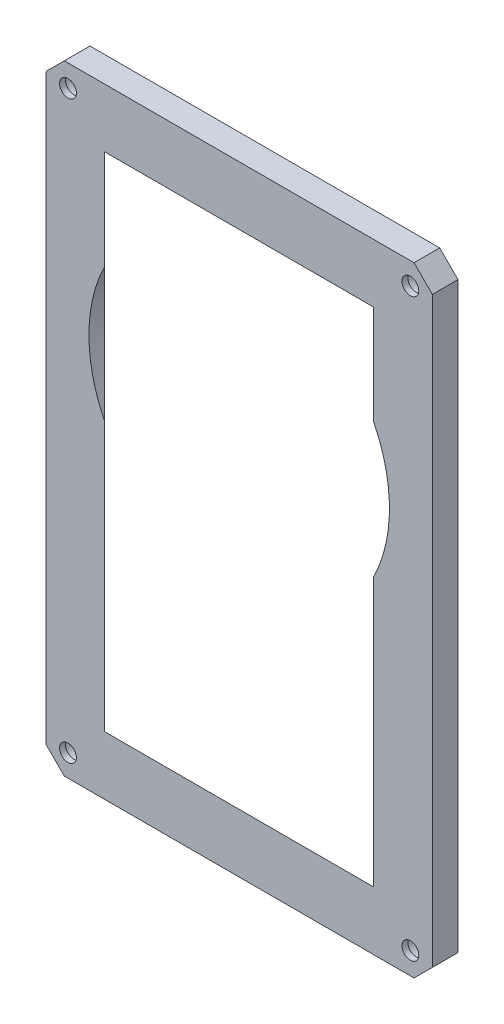
ISO-10303-21;
HEADER;
FILE_DESCRIPTION(('STEP AP214'),'2;1');
FILE_NAME('part.step','',(''),(''),'','','');
FILE_SCHEMA(('AUTOMOTIVE_DESIGN { 1 0 10303 214 1 1 1 1 }'));
ENDSEC;
DATA;
#1=APPLICATION_CONTEXT('core data for automotive mechanical design processes');
#2=APPLICATION_PROTOCOL_DEFINITION('international standard','automotive_design',2000,#1);
#3=PRODUCT_CONTEXT('',#1,'mechanical');
#4=PRODUCT('Part','Part','',(#3));
#5=PRODUCT_RELATED_PRODUCT_CATEGORY('part','',(#4));
#6=PRODUCT_DEFINITION_FORMATION('','',#4);
#7=PRODUCT_DEFINITION_CONTEXT('part definition',#1,'design');
#8=PRODUCT_DEFINITION('design','',#6,#7);
#9=PRODUCT_DEFINITION_SHAPE('','',#8);
#10=(LENGTH_UNIT() NAMED_UNIT(*) SI_UNIT(.MILLI.,.METRE.));
#11=(NAMED_UNIT(*) PLANE_ANGLE_UNIT() SI_UNIT($,.RADIAN.));
#12=(NAMED_UNIT(*) SI_UNIT($,.STERADIAN.) SOLID_ANGLE_UNIT());
#13=UNCERTAINTY_MEASURE_WITH_UNIT(LENGTH_MEASURE(1.E-05),#10,'distance_accuracy_value','');
#14=(GEOMETRIC_REPRESENTATION_CONTEXT(3) GLOBAL_UNCERTAINTY_ASSIGNED_CONTEXT((#13)) GLOBAL_UNIT_ASSIGNED_CONTEXT((#10,
#11,#12)) REPRESENTATION_CONTEXT('',''));
#15=CARTESIAN_POINT('',(0.,0.,0.));
#16=DIRECTION('',(0.,0.,1.));
#17=DIRECTION('',(1.,0.,0.));
#18=AXIS2_PLACEMENT_3D('',#15,#16,#17);
#19=CARTESIAN_POINT('',(-46.7,-78.5,-7.001));
#20=DIRECTION('',(0.,0.,1.));
#21=DIRECTION('',(1.,0.,0.));
#22=AXIS2_PLACEMENT_3D('',#19,#20,#21);
#23=CYLINDRICAL_SURFACE('',#22,2.3);
#24=CARTESIAN_POINT('',(-46.7,-78.5,0.));
#25=DIRECTION('',(0.,0.,1.));
#26=DIRECTION('',(1.,0.,0.));
#27=AXIS2_PLACEMENT_3D('',#24,#25,#26);
#28=CIRCLE('',#27,2.3);
#29=CARTESIAN_POINT('',(-44.4,-78.5,0.));
#30=VERTEX_POINT('',#29);
#31=EDGE_CURVE('E299',#30,#30,#28,.F.);
#32=ORIENTED_EDGE('',*,*,#31,.F.);
#33=EDGE_LOOP('',(#32));
#34=FACE_BOUND('',#33,.T.);
#35=CARTESIAN_POINT('',(-46.7,-78.5,-1.6));
#36=DIRECTION('',(0.,0.,-1.));
#37=DIRECTION('',(-1.,0.,0.));
#38=AXIS2_PLACEMENT_3D('',#35,#36,#37);
#39=CIRCLE('',#38,2.3);
#40=CARTESIAN_POINT('',(-49.,-78.5,-1.6));
#41=VERTEX_POINT('',#40);
#42=EDGE_CURVE('E268',#41,#41,#39,.T.);
#43=ORIENTED_EDGE('',*,*,#42,.T.);
#44=EDGE_LOOP('',(#43));
#45=FACE_BOUND('',#44,.T.);
#46=ADVANCED_FACE('F44',(#34,#45),#23,.F.);
#47=CARTESIAN_POINT('',(46.7,78.5,-7.001));
#48=DIRECTION('',(0.,0.,1.));
#49=DIRECTION('',(1.,0.,0.));
#50=AXIS2_PLACEMENT_3D('',#47,#48,#49);
#51=CYLINDRICAL_SURFACE('',#50,2.3);
#52=CARTESIAN_POINT('',(46.7,78.5,0.));
#53=DIRECTION('',(0.,0.,1.));
#54=DIRECTION('',(1.,0.,0.));
#55=AXIS2_PLACEMENT_3D('',#52,#53,#54);
#56=CIRCLE('',#55,2.3);
#57=CARTESIAN_POINT('',(49.,78.5,0.));
#58=VERTEX_POINT('',#57);
#59=EDGE_CURVE('E300',#58,#58,#56,.F.);
#60=ORIENTED_EDGE('',*,*,#59,.F.);
#61=EDGE_LOOP('',(#60));
#62=FACE_BOUND('',#61,.T.);
#63=CARTESIAN_POINT('',(46.7,78.5,-1.6));
#64=DIRECTION('',(0.,0.,-1.));
#65=DIRECTION('',(-1.,0.,0.));
#66=AXIS2_PLACEMENT_3D('',#63,#64,#65);
#67=CIRCLE('',#66,2.3);
#68=CARTESIAN_POINT('',(44.4,78.5,-1.6));
#69=VERTEX_POINT('',#68);
#70=EDGE_CURVE('E271',#69,#69,#67,.T.);
#71=ORIENTED_EDGE('',*,*,#70,.T.);
#72=EDGE_LOOP('',(#71));
#73=FACE_BOUND('',#72,.T.);
#74=ADVANCED_FACE('F351',(#62,#73),#51,.F.);
#75=CARTESIAN_POINT('',(0.,0.,-7.));
#76=DIRECTION('',(0.,0.,1.));
#77=DIRECTION('',(1.,0.,0.));
#78=AXIS2_PLACEMENT_3D('',#75,#76,#77);
#79=PLANE('',#78);
#80=CARTESIAN_POINT('',(46.7000000000001,-78.5,-7.));
#81=DIRECTION('',(0.,0.,-1.));
#82=DIRECTION('',(1.,0.,0.));
#83=AXIS2_PLACEMENT_3D('',#80,#81,#82);
#84=CIRCLE('',#83,3.7);
#85=CARTESIAN_POINT('',(43.0000000000001,-78.5,-7.));
#86=VERTEX_POINT('',#85);
#87=EDGE_CURVE('E281',#86,#86,#84,.T.);
#88=ORIENTED_EDGE('',*,*,#87,.F.);
#89=EDGE_LOOP('',(#88));
#90=FACE_BOUND('',#89,.T.);
#91=CARTESIAN_POINT('',(-46.7,-78.5,-7.));
#92=DIRECTION('',(0.,0.,-1.));
#93=DIRECTION('',(-1.,0.,0.));
#94=AXIS2_PLACEMENT_3D('',#91,#92,#93);
#95=CIRCLE('',#94,3.7);
#96=CARTESIAN_POINT('',(-50.4,-78.5,-7.));
#97=VERTEX_POINT('',#96);
#98=EDGE_CURVE('E272',#97,#97,#95,.T.);
#99=ORIENTED_EDGE('',*,*,#98,.F.);
#100=EDGE_LOOP('',(#99));
#101=FACE_BOUND('',#100,.T.);
#102=CARTESIAN_POINT('',(-46.7,78.5,-7.));
#103=DIRECTION('',(0.,0.,-1.));
#104=DIRECTION('',(1.,0.,0.));
#105=AXIS2_PLACEMENT_3D('',#102,#103,#104);
#106=CIRCLE('',#105,3.7);
#107=CARTESIAN_POINT('',(-50.4,78.5,-7.));
#108=VERTEX_POINT('',#107);
#109=EDGE_CURVE('E261',#108,#108,#106,.T.);
#110=ORIENTED_EDGE('',*,*,#109,.F.);
#111=EDGE_LOOP('',(#110));
#112=FACE_BOUND('',#111,.T.);
#113=CARTESIAN_POINT('',(46.7,78.5,-7.));
#114=DIRECTION('',(0.,0.,-1.));
#115=DIRECTION('',(-1.,0.,0.));
#116=AXIS2_PLACEMENT_3D('',#113,#114,#115);
#117=CIRCLE('',#116,3.7);
#118=CARTESIAN_POINT('',(43.,78.5,-7.));
#119=VERTEX_POINT('',#118);
#120=EDGE_CURVE('E290',#119,#119,#117,.T.);
#121=ORIENTED_EDGE('',*,*,#120,.F.);
#122=EDGE_LOOP('',(#121));
#123=FACE_BOUND('',#122,.T.);
#124=DIRECTION('',(0.,-1.,0.));
#125=VECTOR('',#124,1.);
#126=CARTESIAN_POINT('',(-43.7000000000002,0.,-7.));
#127=LINE('',#126,#125);
#128=CARTESIAN_POINT('',(-43.7000000000002,75.5000000000002,-7.));
#129=VERTEX_POINT('',#128);
#130=CARTESIAN_POINT('',(-43.7000000000002,-75.5000000000002,-7.));
#131=VERTEX_POINT('',#130);
#132=EDGE_CURVE('E169',#129,#131,#127,.T.);
#133=ORIENTED_EDGE('',*,*,#132,.T.);
#134=DIRECTION('',(1.,0.,0.));
#135=VECTOR('',#134,1.);
#136=CARTESIAN_POINT('',(0.,-75.5000000000002,-7.));
#137=LINE('',#136,#135);
#138=CARTESIAN_POINT('',(43.7000000000002,-75.5000000000002,-7.));
#139=VERTEX_POINT('',#138);
#140=EDGE_CURVE('E165',#131,#139,#137,.T.);
#141=ORIENTED_EDGE('',*,*,#140,.T.);
#142=DIRECTION('',(0.,1.,0.));
#143=VECTOR('',#142,1.);
#144=CARTESIAN_POINT('',(43.7000000000001,0.,-7.));
#145=LINE('',#144,#143);
#146=CARTESIAN_POINT('',(43.7000000000001,75.5000000000002,-7.));
#147=VERTEX_POINT('',#146);
#148=EDGE_CURVE('E243',#139,#147,#145,.T.);
#149=ORIENTED_EDGE('',*,*,#148,.T.);
#150=DIRECTION('',(-1.,0.,0.));
#151=VECTOR('',#150,1.);
#152=CARTESIAN_POINT('',(0.,75.5000000000002,-7.));
#153=LINE('',#152,#151);
#154=EDGE_CURVE('E245',#147,#129,#153,.T.);
#155=ORIENTED_EDGE('',*,*,#154,.T.);
#156=EDGE_LOOP('',(#133,#141,#149,#155));
#157=FACE_BOUND('',#156,.T.);
#158=DIRECTION('',(1.,0.,0.));
#159=VECTOR('',#158,1.);
#160=CARTESIAN_POINT('',(-52.7,-84.5,-7.));
#161=LINE('',#160,#159);
#162=CARTESIAN_POINT('',(-47.7,-84.5,-7.));
#163=VERTEX_POINT('',#162);
#164=CARTESIAN_POINT('',(47.7,-84.5,-7.));
#165=VERTEX_POINT('',#164);
#166=EDGE_CURVE('E309',#163,#165,#161,.T.);
#167=ORIENTED_EDGE('',*,*,#166,.F.);
#168=DIRECTION('',(0.707106781186549,-0.707106781186546,0.));
#169=VECTOR('',#168,1.);
#170=CARTESIAN_POINT('',(-52.7,-79.5,-7.));
#171=LINE('',#170,#169);
#172=CARTESIAN_POINT('',(-52.7,-79.5,-7.));
#173=VERTEX_POINT('',#172);
#174=EDGE_CURVE('E231',#163,#173,#171,.F.);
#175=ORIENTED_EDGE('',*,*,#174,.T.);
#176=DIRECTION('',(0.,-1.,0.));
#177=VECTOR('',#176,1.);
#178=CARTESIAN_POINT('',(-52.7,84.5,-7.));
#179=LINE('',#178,#177);
#180=CARTESIAN_POINT('',(-52.7,79.5,-7.));
#181=VERTEX_POINT('',#180);
#182=EDGE_CURVE('E206',#181,#173,#179,.T.);
#183=ORIENTED_EDGE('',*,*,#182,.F.);
#184=DIRECTION('',(-0.707106781186548,-0.707106781186548,0.));
#185=VECTOR('',#184,1.);
#186=CARTESIAN_POINT('',(-47.7,84.5,-7.));
#187=LINE('',#186,#185);
#188=CARTESIAN_POINT('',(-47.7,84.5,-7.));
#189=VERTEX_POINT('',#188);
#190=EDGE_CURVE('E225',#181,#189,#187,.F.);
#191=ORIENTED_EDGE('',*,*,#190,.T.);
#192=DIRECTION('',(-1.,0.,0.));
#193=VECTOR('',#192,1.);
#194=CARTESIAN_POINT('',(-52.7,84.5,-7.));
#195=LINE('',#194,#193);
#196=CARTESIAN_POINT('',(47.6999999999999,84.5,-7.));
#197=VERTEX_POINT('',#196);
#198=EDGE_CURVE('E198',#197,#189,#195,.T.);
#199=ORIENTED_EDGE('',*,*,#198,.F.);
#200=DIRECTION('',(-0.707106781186548,0.707106781186548,0.));
#201=VECTOR('',#200,1.);
#202=CARTESIAN_POINT('',(52.7,79.4999999999999,-7.));
#203=LINE('',#202,#201);
#204=CARTESIAN_POINT('',(52.7,79.4999999999999,-7.));
#205=VERTEX_POINT('',#204);
#206=EDGE_CURVE('E227',#197,#205,#203,.F.);
#207=ORIENTED_EDGE('',*,*,#206,.T.);
#208=DIRECTION('',(0.,1.,0.));
#209=VECTOR('',#208,1.);
#210=CARTESIAN_POINT('',(52.7,84.5,-7.));
#211=LINE('',#210,#209);
#212=CARTESIAN_POINT('',(52.7,-79.5,-7.));
#213=VERTEX_POINT('',#212);
#214=EDGE_CURVE('E311',#213,#205,#211,.T.);
#215=ORIENTED_EDGE('',*,*,#214,.F.);
#216=DIRECTION('',(0.707106781186547,0.707106781186548,0.));
#217=VECTOR('',#216,1.);
#218=CARTESIAN_POINT('',(47.7,-84.5,-7.));
#219=LINE('',#218,#217);
#220=EDGE_CURVE('E229',#213,#165,#219,.F.);
#221=ORIENTED_EDGE('',*,*,#220,.T.);
#222=EDGE_LOOP('',(#167,#175,#183,#191,#199,#207,#215,#221));
#223=FACE_BOUND('',#222,.T.);
#224=ADVANCED_FACE('F248',(#90,#101,#112,#123,#157,#223),#79,.F.);
#225=CARTESIAN_POINT('',(0.,0.,0.));
#226=DIRECTION('',(0.,0.,1.));
#227=DIRECTION('',(1.,0.,0.));
#228=AXIS2_PLACEMENT_3D('',#225,#226,#227);
#229=PLANE('',#228);
#230=CARTESIAN_POINT('',(0.,23.1,0.));
#231=DIRECTION('',(0.,0.,1.));
#232=DIRECTION('',(1.,0.,0.));
#233=AXIS2_PLACEMENT_3D('',#230,#231,#232);
#234=CIRCLE('',#233,41.);
#235=CARTESIAN_POINT('',(36.7000000000001,4.82132389914427,0.));
#236=VERTEX_POINT('',#235);
#237=CARTESIAN_POINT('',(36.7000000000001,41.3786761008558,0.));
#238=VERTEX_POINT('',#237);
#239=EDGE_CURVE('E68',#236,#238,#234,.T.);
#240=ORIENTED_EDGE('',*,*,#239,.F.);
#241=DIRECTION('',(0.,1.,0.));
#242=VECTOR('',#241,1.);
#243=CARTESIAN_POINT('',(36.7000000000001,0.,0.));
#244=LINE('',#243,#242);
#245=CARTESIAN_POINT('',(36.7000000000001,-68.5000000000001,0.));
#246=VERTEX_POINT('',#245);
#247=EDGE_CURVE('E156',#236,#246,#244,.F.);
#248=ORIENTED_EDGE('',*,*,#247,.T.);
#249=DIRECTION('',(1.,0.,0.));
#250=VECTOR('',#249,1.);
#251=CARTESIAN_POINT('',(0.,-68.5000000000001,0.));
#252=LINE('',#251,#250);
#253=CARTESIAN_POINT('',(-36.7000000000001,-68.5000000000001,0.));
#254=VERTEX_POINT('',#253);
#255=EDGE_CURVE('E11',#246,#254,#252,.F.);
#256=ORIENTED_EDGE('',*,*,#255,.T.);
#257=DIRECTION('',(0.,-1.,0.));
#258=VECTOR('',#257,1.);
#259=CARTESIAN_POINT('',(-36.7000000000001,0.,0.));
#260=LINE('',#259,#258);
#261=CARTESIAN_POINT('',(-36.7000000000001,4.82132389914433,0.));
#262=VERTEX_POINT('',#261);
#263=EDGE_CURVE('E54',#254,#262,#260,.F.);
#264=ORIENTED_EDGE('',*,*,#263,.T.);
#265=CARTESIAN_POINT('',(0.,23.1,0.));
#266=DIRECTION('',(0.,0.,1.));
#267=DIRECTION('',(1.,0.,0.));
#268=AXIS2_PLACEMENT_3D('',#265,#266,#267);
#269=CIRCLE('',#268,41.);
#270=CARTESIAN_POINT('',(-36.7000000000001,41.3786761008557,0.));
#271=VERTEX_POINT('',#270);
#272=EDGE_CURVE('E61',#271,#262,#269,.T.);
#273=ORIENTED_EDGE('',*,*,#272,.F.);
#274=CARTESIAN_POINT('',(-36.7000000000001,68.5000000000001,0.));
#275=VERTEX_POINT('',#274);
#276=EDGE_CURVE('E174',#271,#275,#260,.F.);
#277=ORIENTED_EDGE('',*,*,#276,.T.);
#278=DIRECTION('',(-1.,0.,0.));
#279=VECTOR('',#278,1.);
#280=CARTESIAN_POINT('',(0.,68.5000000000001,0.));
#281=LINE('',#280,#279);
#282=CARTESIAN_POINT('',(36.7000000000001,68.5000000000001,0.));
#283=VERTEX_POINT('',#282);
#284=EDGE_CURVE('E167',#275,#283,#281,.F.);
#285=ORIENTED_EDGE('',*,*,#284,.T.);
#286=EDGE_CURVE('E158',#283,#238,#244,.F.);
#287=ORIENTED_EDGE('',*,*,#286,.T.);
#288=EDGE_LOOP('',(#240,#248,#256,#264,#273,#277,#285,#287));
#289=FACE_BOUND('',#288,.T.);
#290=ORIENTED_EDGE('',*,*,#31,.T.);
#291=EDGE_LOOP('',(#290));
#292=FACE_BOUND('',#291,.T.);
#293=CARTESIAN_POINT('',(46.7000000000001,-78.5,0.));
#294=DIRECTION('',(0.,0.,1.));
#295=DIRECTION('',(1.,0.,0.));
#296=AXIS2_PLACEMENT_3D('',#293,#294,#295);
#297=CIRCLE('',#296,2.3);
#298=CARTESIAN_POINT('',(49.0000000000001,-78.5,0.));
#299=VERTEX_POINT('',#298);
#300=EDGE_CURVE('E294',#299,#299,#297,.T.);
#301=ORIENTED_EDGE('',*,*,#300,.F.);
#302=EDGE_LOOP('',(#301));
#303=FACE_BOUND('',#302,.T.);
#304=CARTESIAN_POINT('',(-46.7,78.5,0.));
#305=DIRECTION('',(0.,0.,1.));
#306=DIRECTION('',(1.,0.,0.));
#307=AXIS2_PLACEMENT_3D('',#304,#305,#306);
#308=CIRCLE('',#307,2.3);
#309=CARTESIAN_POINT('',(-44.4,78.5,0.));
#310=VERTEX_POINT('',#309);
#311=EDGE_CURVE('E179',#310,#310,#308,.T.);
#312=ORIENTED_EDGE('',*,*,#311,.F.);
#313=EDGE_LOOP('',(#312));
#314=FACE_BOUND('',#313,.T.);
#315=DIRECTION('',(0.,-1.,0.));
#316=VECTOR('',#315,1.);
#317=CARTESIAN_POINT('',(-52.7,84.5,0.));
#318=LINE('',#317,#316);
#319=CARTESIAN_POINT('',(-52.7,79.5,0.));
#320=VERTEX_POINT('',#319);
#321=CARTESIAN_POINT('',(-52.7,-79.5,0.));
#322=VERTEX_POINT('',#321);
#323=EDGE_CURVE('E184',#320,#322,#318,.T.);
#324=ORIENTED_EDGE('',*,*,#323,.T.);
#325=DIRECTION('',(-0.707106781186549,0.707106781186546,0.));
#326=VECTOR('',#325,1.);
#327=CARTESIAN_POINT('',(-66.0999999999999,-66.1000000000002,0.));
#328=LINE('',#327,#326);
#329=CARTESIAN_POINT('',(-47.7,-84.5,0.));
#330=VERTEX_POINT('',#329);
#331=EDGE_CURVE('E218',#322,#330,#328,.F.);
#332=ORIENTED_EDGE('',*,*,#331,.T.);
#333=DIRECTION('',(1.,0.,0.));
#334=VECTOR('',#333,1.);
#335=CARTESIAN_POINT('',(-52.7,-84.5,0.));
#336=LINE('',#335,#334);
#337=CARTESIAN_POINT('',(47.7,-84.5,0.));
#338=VERTEX_POINT('',#337);
#339=EDGE_CURVE('E190',#330,#338,#336,.T.);
#340=ORIENTED_EDGE('',*,*,#339,.T.);
#341=DIRECTION('',(-0.707106781186547,-0.707106781186548,0.));
#342=VECTOR('',#341,1.);
#343=CARTESIAN_POINT('',(66.1,-66.0999999999999,0.));
#344=LINE('',#343,#342);
#345=CARTESIAN_POINT('',(52.7,-79.5,0.));
#346=VERTEX_POINT('',#345);
#347=EDGE_CURVE('E216',#338,#346,#344,.F.);
#348=ORIENTED_EDGE('',*,*,#347,.T.);
#349=DIRECTION('',(0.,1.,0.));
#350=VECTOR('',#349,1.);
#351=CARTESIAN_POINT('',(52.7,84.5,0.));
#352=LINE('',#351,#350);
#353=CARTESIAN_POINT('',(52.7,79.4999999999999,0.));
#354=VERTEX_POINT('',#353);
#355=EDGE_CURVE('E195',#346,#354,#352,.T.);
#356=ORIENTED_EDGE('',*,*,#355,.T.);
#357=DIRECTION('',(0.707106781186548,-0.707106781186548,0.));
#358=VECTOR('',#357,1.);
#359=CARTESIAN_POINT('',(66.1,66.1,0.));
#360=LINE('',#359,#358);
#361=CARTESIAN_POINT('',(47.6999999999999,84.5,0.));
#362=VERTEX_POINT('',#361);
#363=EDGE_CURVE('E214',#354,#362,#360,.F.);
#364=ORIENTED_EDGE('',*,*,#363,.T.);
#365=DIRECTION('',(-1.,0.,0.));
#366=VECTOR('',#365,1.);
#367=CARTESIAN_POINT('',(-52.7,84.5,0.));
#368=LINE('',#367,#366);
#369=CARTESIAN_POINT('',(-47.7,84.5,0.));
#370=VERTEX_POINT('',#369);
#371=EDGE_CURVE('E203',#362,#370,#368,.T.);
#372=ORIENTED_EDGE('',*,*,#371,.T.);
#373=DIRECTION('',(0.707106781186548,0.707106781186548,0.));
#374=VECTOR('',#373,1.);
#375=CARTESIAN_POINT('',(-66.1,66.1,0.));
#376=LINE('',#375,#374);
#377=EDGE_CURVE('E212',#370,#320,#376,.F.);
#378=ORIENTED_EDGE('',*,*,#377,.T.);
#379=EDGE_LOOP('',(#324,#332,#340,#348,#356,#364,#372,#378));
#380=FACE_BOUND('',#379,.T.);
#381=ORIENTED_EDGE('',*,*,#59,.T.);
#382=EDGE_LOOP('',(#381));
#383=FACE_BOUND('',#382,.T.);
#384=ADVANCED_FACE('F154',(#289,#292,#303,#314,#380,#383),#229,.T.);
#385=CARTESIAN_POINT('',(-52.7,84.5,-7.));
#386=DIRECTION('',(-1.,0.,0.));
#387=DIRECTION('',(0.,-1.,0.));
#388=AXIS2_PLACEMENT_3D('',#385,#386,#387);
#389=PLANE('',#388);
#390=ORIENTED_EDGE('',*,*,#182,.T.);
#391=DIRECTION('',(0.,0.,1.));
#392=VECTOR('',#391,1.);
#393=CARTESIAN_POINT('',(-52.7,-79.5,-7.));
#394=LINE('',#393,#392);
#395=EDGE_CURVE('E209',#173,#322,#394,.T.);
#396=ORIENTED_EDGE('',*,*,#395,.T.);
#397=ORIENTED_EDGE('',*,*,#323,.F.);
#398=DIRECTION('',(0.,0.,-1.));
#399=VECTOR('',#398,1.);
#400=CARTESIAN_POINT('',(-52.7,79.5,-7.));
#401=LINE('',#400,#399);
#402=EDGE_CURVE('E207',#320,#181,#401,.T.);
#403=ORIENTED_EDGE('',*,*,#402,.T.);
#404=EDGE_LOOP('',(#390,#396,#397,#403));
#405=FACE_BOUND('',#404,.T.);
#406=ADVANCED_FACE('F330',(#405),#389,.T.);
#407=CARTESIAN_POINT('',(-52.7,84.5,-7.));
#408=DIRECTION('',(0.,1.,0.));
#409=DIRECTION('',(0.,0.,1.));
#410=AXIS2_PLACEMENT_3D('',#407,#408,#409);
#411=PLANE('',#410);
#412=ORIENTED_EDGE('',*,*,#371,.F.);
#413=DIRECTION('',(0.,0.,-1.));
#414=VECTOR('',#413,1.);
#415=CARTESIAN_POINT('',(47.6999999999999,84.5,-7.));
#416=LINE('',#415,#414);
#417=EDGE_CURVE('E241',#362,#197,#416,.T.);
#418=ORIENTED_EDGE('',*,*,#417,.T.);
#419=ORIENTED_EDGE('',*,*,#198,.T.);
#420=DIRECTION('',(0.,0.,1.));
#421=VECTOR('',#420,1.);
#422=CARTESIAN_POINT('',(-47.7,84.5,-7.));
#423=LINE('',#422,#421);
#424=EDGE_CURVE('E238',#189,#370,#423,.T.);
#425=ORIENTED_EDGE('',*,*,#424,.T.);
#426=EDGE_LOOP('',(#412,#418,#419,#425));
#427=FACE_BOUND('',#426,.T.);
#428=ADVANCED_FACE('F321',(#427),#411,.T.);
#429=CARTESIAN_POINT('',(52.7,84.5,-7.));
#430=DIRECTION('',(1.,0.,0.));
#431=DIRECTION('',(0.,1.,0.));
#432=AXIS2_PLACEMENT_3D('',#429,#430,#431);
#433=PLANE('',#432);
#434=ORIENTED_EDGE('',*,*,#355,.F.);
#435=DIRECTION('',(0.,0.,-1.));
#436=VECTOR('',#435,1.);
#437=CARTESIAN_POINT('',(52.7,-79.5,-7.));
#438=LINE('',#437,#436);
#439=EDGE_CURVE('E236',#346,#213,#438,.T.);
#440=ORIENTED_EDGE('',*,*,#439,.T.);
#441=ORIENTED_EDGE('',*,*,#214,.T.);
#442=DIRECTION('',(0.,0.,1.));
#443=VECTOR('',#442,1.);
#444=CARTESIAN_POINT('',(52.7,79.4999999999999,-7.));
#445=LINE('',#444,#443);
#446=EDGE_CURVE('E233',#205,#354,#445,.T.);
#447=ORIENTED_EDGE('',*,*,#446,.T.);
#448=EDGE_LOOP('',(#434,#440,#441,#447));
#449=FACE_BOUND('',#448,.T.);
#450=ADVANCED_FACE('F347',(#449),#433,.T.);
#451=CARTESIAN_POINT('',(-52.7,-84.5,-7.));
#452=DIRECTION('',(0.,-1.,0.));
#453=DIRECTION('',(0.,0.,-1.));
#454=AXIS2_PLACEMENT_3D('',#451,#452,#453);
#455=PLANE('',#454);
#456=ORIENTED_EDGE('',*,*,#339,.F.);
#457=DIRECTION('',(0.,0.,-1.));
#458=VECTOR('',#457,1.);
#459=CARTESIAN_POINT('',(-47.7,-84.5,-7.));
#460=LINE('',#459,#458);
#461=EDGE_CURVE('E223',#330,#163,#460,.T.);
#462=ORIENTED_EDGE('',*,*,#461,.T.);
#463=ORIENTED_EDGE('',*,*,#166,.T.);
#464=DIRECTION('',(0.,0.,1.));
#465=VECTOR('',#464,1.);
#466=CARTESIAN_POINT('',(47.7,-84.5,-7.));
#467=LINE('',#466,#465);
#468=EDGE_CURVE('E220',#165,#338,#467,.T.);
#469=ORIENTED_EDGE('',*,*,#468,.T.);
#470=EDGE_LOOP('',(#456,#462,#463,#469));
#471=FACE_BOUND('',#470,.T.);
#472=ADVANCED_FACE('F339',(#471),#455,.T.);
#473=CARTESIAN_POINT('',(-52.7,-79.5,-7.));
#474=DIRECTION('',(0.707106781186546,0.707106781186549,0.));
#475=DIRECTION('',(0.,0.,1.));
#476=AXIS2_PLACEMENT_3D('',#473,#474,#475);
#477=PLANE('',#476);
#478=ORIENTED_EDGE('',*,*,#174,.F.);
#479=ORIENTED_EDGE('',*,*,#461,.F.);
#480=ORIENTED_EDGE('',*,*,#331,.F.);
#481=ORIENTED_EDGE('',*,*,#395,.F.);
#482=EDGE_LOOP('',(#478,#479,#480,#481));
#483=FACE_BOUND('',#482,.T.);
#484=ADVANCED_FACE('F335',(#483),#477,.F.);
#485=CARTESIAN_POINT('',(47.7,-84.5,-7.));
#486=DIRECTION('',(-0.707106781186548,0.707106781186547,0.));
#487=DIRECTION('',(0.,0.,1.));
#488=AXIS2_PLACEMENT_3D('',#485,#486,#487);
#489=PLANE('',#488);
#490=ORIENTED_EDGE('',*,*,#220,.F.);
#491=ORIENTED_EDGE('',*,*,#439,.F.);
#492=ORIENTED_EDGE('',*,*,#347,.F.);
#493=ORIENTED_EDGE('',*,*,#468,.F.);
#494=EDGE_LOOP('',(#490,#491,#492,#493));
#495=FACE_BOUND('',#494,.T.);
#496=ADVANCED_FACE('F344',(#495),#489,.F.);
#497=CARTESIAN_POINT('',(52.7,79.4999999999999,-7.));
#498=DIRECTION('',(-0.707106781186547,-0.707106781186547,0.));
#499=DIRECTION('',(0.,0.,1.));
#500=AXIS2_PLACEMENT_3D('',#497,#498,#499);
#501=PLANE('',#500);
#502=ORIENTED_EDGE('',*,*,#206,.F.);
#503=ORIENTED_EDGE('',*,*,#417,.F.);
#504=ORIENTED_EDGE('',*,*,#363,.F.);
#505=ORIENTED_EDGE('',*,*,#446,.F.);
#506=EDGE_LOOP('',(#502,#503,#504,#505));
#507=FACE_BOUND('',#506,.T.);
#508=ADVANCED_FACE('F349',(#507),#501,.F.);
#509=CARTESIAN_POINT('',(-47.7,84.5,-7.));
#510=DIRECTION('',(0.707106781186547,-0.707106781186547,0.));
#511=DIRECTION('',(0.,0.,1.));
#512=AXIS2_PLACEMENT_3D('',#509,#510,#511);
#513=PLANE('',#512);
#514=ORIENTED_EDGE('',*,*,#190,.F.);
#515=ORIENTED_EDGE('',*,*,#402,.F.);
#516=ORIENTED_EDGE('',*,*,#377,.F.);
#517=ORIENTED_EDGE('',*,*,#424,.F.);
#518=EDGE_LOOP('',(#514,#515,#516,#517));
#519=FACE_BOUND('',#518,.T.);
#520=ADVANCED_FACE('F326',(#519),#513,.F.);
#521=CARTESIAN_POINT('',(0.,75.5000000000002,-7.));
#522=DIRECTION('',(0.,0.707106781186544,0.707106781186551));
#523=DIRECTION('',(-1.,0.,0.));
#524=AXIS2_PLACEMENT_3D('',#521,#522,#523);
#525=PLANE('',#524);
#526=DIRECTION('',(-0.577350269189628,-0.577350269189628,0.577350269189622));
#527=VECTOR('',#526,1.);
#528=CARTESIAN_POINT('',(18.5333333333332,50.3333333333333,18.1666666666666));
#529=LINE('',#528,#527);
#530=EDGE_CURVE('E180',#283,#147,#529,.F.);
#531=ORIENTED_EDGE('',*,*,#530,.F.);
#532=ORIENTED_EDGE('',*,*,#284,.F.);
#533=DIRECTION('',(0.577350269189628,-0.577350269189628,0.577350269189622));
#534=VECTOR('',#533,1.);
#535=CARTESIAN_POINT('',(-29.1333333333334,60.9333333333333,7.56666666666668));
#536=LINE('',#535,#534);
#537=EDGE_CURVE('E49',#129,#275,#536,.T.);
#538=ORIENTED_EDGE('',*,*,#537,.F.);
#539=ORIENTED_EDGE('',*,*,#154,.F.);
#540=EDGE_LOOP('',(#531,#532,#538,#539));
#541=FACE_BOUND('',#540,.T.);
#542=ADVANCED_FACE('F47',(#541),#525,.F.);
#543=CARTESIAN_POINT('',(-43.7000000000002,0.,-7.));
#544=DIRECTION('',(-0.707106781186544,0.,0.707106781186551));
#545=DIRECTION('',(0.,-1.,0.));
#546=AXIS2_PLACEMENT_3D('',#543,#544,#545);
#547=PLANE('',#546);
#548=CARTESIAN_POINT('',(0.,23.1,36.6999999999997));
#549=DIRECTION('',(-0.707106781186544,0.,0.707106781186551));
#550=DIRECTION('',(0.707106781186551,0.,0.707106781186544));
#551=AXIS2_PLACEMENT_3D('',#548,#549,#550);
#552=ELLIPSE('',#551,57.9827560572966,41.);
#553=EDGE_CURVE('E151',#271,#262,#552,.T.);
#554=ORIENTED_EDGE('',*,*,#553,.T.);
#555=ORIENTED_EDGE('',*,*,#263,.F.);
#556=DIRECTION('',(0.577350269189628,0.577350269189628,0.577350269189622));
#557=VECTOR('',#556,1.);
#558=CARTESIAN_POINT('',(-18.5333333333333,-50.3333333333333,18.1666666666666));
#559=LINE('',#558,#557);
#560=EDGE_CURVE('E178',#131,#254,#559,.T.);
#561=ORIENTED_EDGE('',*,*,#560,.F.);
#562=ORIENTED_EDGE('',*,*,#132,.F.);
#563=ORIENTED_EDGE('',*,*,#537,.T.);
#564=ORIENTED_EDGE('',*,*,#276,.F.);
#565=EDGE_LOOP('',(#554,#555,#561,#562,#563,#564));
#566=FACE_BOUND('',#565,.T.);
#567=ADVANCED_FACE('F253',(#566),#547,.F.);
#568=CARTESIAN_POINT('',(43.7000000000001,0.,-7.));
#569=DIRECTION('',(0.707106781186544,0.,0.707106781186551));
#570=DIRECTION('',(0.,1.,0.));
#571=AXIS2_PLACEMENT_3D('',#568,#569,#570);
#572=PLANE('',#571);
#573=CARTESIAN_POINT('',(0.,23.1,36.6999999999997));
#574=DIRECTION('',(0.707106781186544,0.,0.707106781186551));
#575=DIRECTION('',(-0.707106781186551,0.,0.707106781186544));
#576=AXIS2_PLACEMENT_3D('',#573,#574,#575);
#577=ELLIPSE('',#576,57.9827560572966,41.);
#578=EDGE_CURVE('E145',#236,#238,#577,.T.);
#579=ORIENTED_EDGE('',*,*,#578,.T.);
#580=ORIENTED_EDGE('',*,*,#286,.F.);
#581=ORIENTED_EDGE('',*,*,#530,.T.);
#582=ORIENTED_EDGE('',*,*,#148,.F.);
#583=DIRECTION('',(0.577350269189628,-0.577350269189628,-0.577350269189622));
#584=VECTOR('',#583,1.);
#585=CARTESIAN_POINT('',(18.5333333333332,-50.3333333333333,18.1666666666666));
#586=LINE('',#585,#584);
#587=EDGE_CURVE('E164',#246,#139,#586,.T.);
#588=ORIENTED_EDGE('',*,*,#587,.F.);
#589=ORIENTED_EDGE('',*,*,#247,.F.);
#590=EDGE_LOOP('',(#579,#580,#581,#582,#588,#589));
#591=FACE_BOUND('',#590,.T.);
#592=ADVANCED_FACE('F162',(#591),#572,.F.);
#593=CARTESIAN_POINT('',(0.,-75.5000000000002,-7.));
#594=DIRECTION('',(0.,-0.707106781186544,0.707106781186551));
#595=DIRECTION('',(1.,0.,0.));
#596=AXIS2_PLACEMENT_3D('',#593,#594,#595);
#597=PLANE('',#596);
#598=ORIENTED_EDGE('',*,*,#560,.T.);
#599=ORIENTED_EDGE('',*,*,#255,.F.);
#600=ORIENTED_EDGE('',*,*,#587,.T.);
#601=ORIENTED_EDGE('',*,*,#140,.F.);
#602=EDGE_LOOP('',(#598,#599,#600,#601));
#603=FACE_BOUND('',#602,.T.);
#604=ADVANCED_FACE('F255',(#603),#597,.F.);
#605=CARTESIAN_POINT('',(-46.7,78.5,-7.001));
#606=DIRECTION('',(0.,0.,1.));
#607=DIRECTION('',(1.,0.,0.));
#608=AXIS2_PLACEMENT_3D('',#605,#606,#607);
#609=CYLINDRICAL_SURFACE('',#608,2.3);
#610=CARTESIAN_POINT('',(-46.7,78.5,-1.6));
#611=DIRECTION('',(0.,0.,-1.));
#612=DIRECTION('',(-1.,0.,0.));
#613=AXIS2_PLACEMENT_3D('',#610,#611,#612);
#614=CIRCLE('',#613,2.3);
#615=CARTESIAN_POINT('',(-49.,78.5,-1.6));
#616=VERTEX_POINT('',#615);
#617=EDGE_CURVE('E264',#616,#616,#614,.T.);
#618=ORIENTED_EDGE('',*,*,#617,.T.);
#619=EDGE_LOOP('',(#618));
#620=FACE_BOUND('',#619,.T.);
#621=ORIENTED_EDGE('',*,*,#311,.T.);
#622=EDGE_LOOP('',(#621));
#623=FACE_BOUND('',#622,.T.);
#624=ADVANCED_FACE('F372',(#620,#623),#609,.F.);
#625=CARTESIAN_POINT('',(46.7000000000001,-78.5,-7.001));
#626=DIRECTION('',(0.,0.,1.));
#627=DIRECTION('',(1.,0.,0.));
#628=AXIS2_PLACEMENT_3D('',#625,#626,#627);
#629=CYLINDRICAL_SURFACE('',#628,2.3);
#630=CARTESIAN_POINT('',(46.7000000000001,-78.5,-1.6));
#631=DIRECTION('',(0.,0.,-1.));
#632=DIRECTION('',(-1.,0.,0.));
#633=AXIS2_PLACEMENT_3D('',#630,#631,#632);
#634=CIRCLE('',#633,2.3);
#635=CARTESIAN_POINT('',(44.4000000000001,-78.5,-1.6));
#636=VERTEX_POINT('',#635);
#637=EDGE_CURVE('E278',#636,#636,#634,.T.);
#638=ORIENTED_EDGE('',*,*,#637,.T.);
#639=EDGE_LOOP('',(#638));
#640=FACE_BOUND('',#639,.T.);
#641=ORIENTED_EDGE('',*,*,#300,.T.);
#642=EDGE_LOOP('',(#641));
#643=FACE_BOUND('',#642,.T.);
#644=ADVANCED_FACE('F374',(#640,#643),#629,.F.);
#645=CARTESIAN_POINT('',(46.7,78.5,-1.6));
#646=DIRECTION('',(0.,0.,-1.));
#647=DIRECTION('',(-1.,0.,0.));
#648=AXIS2_PLACEMENT_3D('',#645,#646,#647);
#649=CYLINDRICAL_SURFACE('',#648,3.7);
#650=CARTESIAN_POINT('',(46.7,78.5,-1.6));
#651=DIRECTION('',(0.,0.,-1.));
#652=DIRECTION('',(-1.,0.,0.));
#653=AXIS2_PLACEMENT_3D('',#650,#651,#652);
#654=CIRCLE('',#653,3.7);
#655=CARTESIAN_POINT('',(43.,78.5,-1.6));
#656=VERTEX_POINT('',#655);
#657=EDGE_CURVE('E291',#656,#656,#654,.T.);
#658=CARTESIAN_POINT('',(43.,78.5,-1.6));
#659=CARTESIAN_POINT('',(43.,78.5,-1.65625));
#660=CARTESIAN_POINT('',(43.,78.5,-1.7125));
#661=CARTESIAN_POINT('',(43.,78.5,-1.825));
#662=CARTESIAN_POINT('',(43.,78.5,-1.88125));
#663=CARTESIAN_POINT('',(43.,78.5,-1.99375));
#664=CARTESIAN_POINT('',(43.,78.5,-2.05));
#665=CARTESIAN_POINT('',(43.,78.5,-2.1625));
#666=CARTESIAN_POINT('',(43.,78.5,-2.21875));
#667=CARTESIAN_POINT('',(43.,78.5,-2.33125));
#668=CARTESIAN_POINT('',(43.,78.5,-2.3875));
#669=CARTESIAN_POINT('',(43.,78.5,-2.5));
#670=CARTESIAN_POINT('',(43.,78.5,-2.55625));
#671=CARTESIAN_POINT('',(43.,78.5,-2.66875));
#672=CARTESIAN_POINT('',(43.,78.5,-2.725));
#673=CARTESIAN_POINT('',(43.,78.5,-2.8375));
#674=CARTESIAN_POINT('',(43.,78.5,-2.89375));
#675=CARTESIAN_POINT('',(43.,78.5,-3.00625));
#676=CARTESIAN_POINT('',(43.,78.5,-3.0625));
#677=CARTESIAN_POINT('',(43.,78.5,-3.175));
#678=CARTESIAN_POINT('',(43.,78.5,-3.23125));
#679=CARTESIAN_POINT('',(43.,78.5,-3.34375));
#680=CARTESIAN_POINT('',(43.,78.5,-3.4));
#681=CARTESIAN_POINT('',(43.,78.5,-3.5125));
#682=CARTESIAN_POINT('',(43.,78.5,-3.56875));
#683=CARTESIAN_POINT('',(43.,78.5,-3.68125));
#684=CARTESIAN_POINT('',(43.,78.5,-3.7375));
#685=CARTESIAN_POINT('',(43.,78.5,-3.85));
#686=CARTESIAN_POINT('',(43.,78.5,-3.90625));
#687=CARTESIAN_POINT('',(43.,78.5,-4.01875));
#688=CARTESIAN_POINT('',(43.,78.5,-4.075));
#689=CARTESIAN_POINT('',(43.,78.5,-4.1875));
#690=CARTESIAN_POINT('',(43.,78.5,-4.24375));
#691=CARTESIAN_POINT('',(43.,78.5,-4.35625));
#692=CARTESIAN_POINT('',(43.,78.5,-4.4125));
#693=CARTESIAN_POINT('',(43.,78.5,-4.525));
#694=CARTESIAN_POINT('',(43.,78.5,-4.58125));
#695=CARTESIAN_POINT('',(43.,78.5,-4.69375));
#696=CARTESIAN_POINT('',(43.,78.5,-4.75));
#697=CARTESIAN_POINT('',(43.,78.5,-4.8625));
#698=CARTESIAN_POINT('',(43.,78.5,-4.91875));
#699=CARTESIAN_POINT('',(43.,78.5,-5.03125));
#700=CARTESIAN_POINT('',(43.,78.5,-5.0875));
#701=CARTESIAN_POINT('',(43.,78.5,-5.2));
#702=CARTESIAN_POINT('',(43.,78.5,-5.25625));
#703=CARTESIAN_POINT('',(43.,78.5,-5.36875));
#704=CARTESIAN_POINT('',(43.,78.5,-5.425));
#705=CARTESIAN_POINT('',(43.,78.5,-5.5375));
#706=CARTESIAN_POINT('',(43.,78.5,-5.59375));
#707=CARTESIAN_POINT('',(43.,78.5,-5.70625));
#708=CARTESIAN_POINT('',(43.,78.5,-5.7625));
#709=CARTESIAN_POINT('',(43.,78.5,-5.875));
#710=CARTESIAN_POINT('',(43.,78.5,-5.93125));
#711=CARTESIAN_POINT('',(43.,78.5,-6.04375));
#712=CARTESIAN_POINT('',(43.,78.5,-6.1));
#713=CARTESIAN_POINT('',(43.,78.5,-6.2125));
#714=CARTESIAN_POINT('',(43.,78.5,-6.26875));
#715=CARTESIAN_POINT('',(43.,78.5,-6.38125));
#716=CARTESIAN_POINT('',(43.,78.5,-6.4375));
#717=CARTESIAN_POINT('',(43.,78.5,-6.55));
#718=CARTESIAN_POINT('',(43.,78.5,-6.60625));
#719=CARTESIAN_POINT('',(43.,78.5,-6.71875));
#720=CARTESIAN_POINT('',(43.,78.5,-6.775));
#721=CARTESIAN_POINT('',(43.,78.5,-6.8875));
#722=CARTESIAN_POINT('',(43.,78.5,-6.94375));
#723=CARTESIAN_POINT('',(43.,78.5,-7.));
#724=B_SPLINE_CURVE_WITH_KNOTS('',3,(#658,#659,#660,#661,#662,#663,#664,#665,#666,#667,#668,
#669,#670,#671,#672,#673,#674,#675,#676,#677,#678,#679,#680,#681,#682,#683,#684,#685,#686,#687,
#688,#689,#690,#691,#692,#693,#694,#695,#696,#697,#698,#699,#700,#701,#702,#703,#704,#705,#706,
#707,#708,#709,#710,#711,#712,#713,#714,#715,#716,#717,#718,#719,#720,#721,#722,#723),
.UNSPECIFIED.,.F.,.F.,(4,2,2,2,2,2,2,2,2,2,2,2,2,2,2,2,2,2,2,2,2,2,2,2,2,2,2,2,2,2,2,2,4),(0.,
0.16875,0.3375,0.50625,0.675,0.84375,1.0125,1.18125,1.35,1.51875,1.6875,1.85625,2.025,2.19375,
2.3625,2.53125,2.7,2.86875,3.0375,3.20625,3.375,3.54375,3.7125,3.88125,4.05,4.21875,4.3875,
4.55625,4.725,4.89375,5.0625,5.23125,5.4),.UNSPECIFIED.);
#725=EDGE_CURVE('BSEAM380',#656,#119,#724,.T.);
#726=ORIENTED_EDGE('',*,*,#657,.F.);
#727=ORIENTED_EDGE('',*,*,#120,.T.);
#728=ORIENTED_EDGE('',*,*,#725,.T.);
#729=ORIENTED_EDGE('',*,*,#725,.F.);
#730=EDGE_LOOP('',(#726,#728,#727,#729));
#731=FACE_BOUND('',#730,.T.);
#732=ADVANCED_FACE('F380',(#731),#649,.F.);
#733=CARTESIAN_POINT('',(46.7,78.5,-1.6));
#734=DIRECTION('',(0.,0.,-1.));
#735=DIRECTION('',(-1.,0.,0.));
#736=AXIS2_PLACEMENT_3D('',#733,#734,#735);
#737=PLANE('',#736);
#738=ORIENTED_EDGE('',*,*,#70,.F.);
#739=EDGE_LOOP('',(#738));
#740=FACE_BOUND('',#739,.T.);
#741=ORIENTED_EDGE('',*,*,#657,.T.);
#742=EDGE_LOOP('',(#741));
#743=FACE_BOUND('',#742,.T.);
#744=ADVANCED_FACE('F405',(#740,#743),#737,.T.);
#745=CARTESIAN_POINT('',(-46.7,-78.5,-1.6));
#746=DIRECTION('',(0.,0.,-1.));
#747=DIRECTION('',(-1.,0.,0.));
#748=AXIS2_PLACEMENT_3D('',#745,#746,#747);
#749=CYLINDRICAL_SURFACE('',#748,3.7);
#750=CARTESIAN_POINT('',(-46.7,-78.5,-1.6));
#751=DIRECTION('',(0.,0.,-1.));
#752=DIRECTION('',(-1.,0.,0.));
#753=AXIS2_PLACEMENT_3D('',#750,#751,#752);
#754=CIRCLE('',#753,3.7);
#755=CARTESIAN_POINT('',(-50.4,-78.5,-1.6));
#756=VERTEX_POINT('',#755);
#757=EDGE_CURVE('E275',#756,#756,#754,.T.);
#758=CARTESIAN_POINT('',(-50.4,-78.5,-1.6));
#759=CARTESIAN_POINT('',(-50.4,-78.5,-1.65625));
#760=CARTESIAN_POINT('',(-50.4,-78.5,-1.7125));
#761=CARTESIAN_POINT('',(-50.4,-78.5,-1.825));
#762=CARTESIAN_POINT('',(-50.4,-78.5,-1.88125));
#763=CARTESIAN_POINT('',(-50.4,-78.5,-1.99375));
#764=CARTESIAN_POINT('',(-50.4,-78.5,-2.05));
#765=CARTESIAN_POINT('',(-50.4,-78.5,-2.1625));
#766=CARTESIAN_POINT('',(-50.4,-78.5,-2.21875));
#767=CARTESIAN_POINT('',(-50.4,-78.5,-2.33125));
#768=CARTESIAN_POINT('',(-50.4,-78.5,-2.3875));
#769=CARTESIAN_POINT('',(-50.4,-78.5,-2.5));
#770=CARTESIAN_POINT('',(-50.4,-78.5,-2.55625));
#771=CARTESIAN_POINT('',(-50.4,-78.5,-2.66875));
#772=CARTESIAN_POINT('',(-50.4,-78.5,-2.725));
#773=CARTESIAN_POINT('',(-50.4,-78.5,-2.8375));
#774=CARTESIAN_POINT('',(-50.4,-78.5,-2.89375));
#775=CARTESIAN_POINT('',(-50.4,-78.5,-3.00625));
#776=CARTESIAN_POINT('',(-50.4,-78.5,-3.0625));
#777=CARTESIAN_POINT('',(-50.4,-78.5,-3.175));
#778=CARTESIAN_POINT('',(-50.4,-78.5,-3.23125));
#779=CARTESIAN_POINT('',(-50.4,-78.5,-3.34375));
#780=CARTESIAN_POINT('',(-50.4,-78.5,-3.4));
#781=CARTESIAN_POINT('',(-50.4,-78.5,-3.5125));
#782=CARTESIAN_POINT('',(-50.4,-78.5,-3.56875));
#783=CARTESIAN_POINT('',(-50.4,-78.5,-3.68125));
#784=CARTESIAN_POINT('',(-50.4,-78.5,-3.7375));
#785=CARTESIAN_POINT('',(-50.4,-78.5,-3.85));
#786=CARTESIAN_POINT('',(-50.4,-78.5,-3.90625));
#787=CARTESIAN_POINT('',(-50.4,-78.5,-4.01875));
#788=CARTESIAN_POINT('',(-50.4,-78.5,-4.075));
#789=CARTESIAN_POINT('',(-50.4,-78.5,-4.1875));
#790=CARTESIAN_POINT('',(-50.4,-78.5,-4.24375));
#791=CARTESIAN_POINT('',(-50.4,-78.5,-4.35625));
#792=CARTESIAN_POINT('',(-50.4,-78.5,-4.4125));
#793=CARTESIAN_POINT('',(-50.4,-78.5,-4.525));
#794=CARTESIAN_POINT('',(-50.4,-78.5,-4.58125));
#795=CARTESIAN_POINT('',(-50.4,-78.5,-4.69375));
#796=CARTESIAN_POINT('',(-50.4,-78.5,-4.75));
#797=CARTESIAN_POINT('',(-50.4,-78.5,-4.8625));
#798=CARTESIAN_POINT('',(-50.4,-78.5,-4.91875));
#799=CARTESIAN_POINT('',(-50.4,-78.5,-5.03125));
#800=CARTESIAN_POINT('',(-50.4,-78.5,-5.0875));
#801=CARTESIAN_POINT('',(-50.4,-78.5,-5.2));
#802=CARTESIAN_POINT('',(-50.4,-78.5,-5.25625));
#803=CARTESIAN_POINT('',(-50.4,-78.5,-5.36875));
#804=CARTESIAN_POINT('',(-50.4,-78.5,-5.425));
#805=CARTESIAN_POINT('',(-50.4,-78.5,-5.5375));
#806=CARTESIAN_POINT('',(-50.4,-78.5,-5.59375));
#807=CARTESIAN_POINT('',(-50.4,-78.5,-5.70625));
#808=CARTESIAN_POINT('',(-50.4,-78.5,-5.7625));
#809=CARTESIAN_POINT('',(-50.4,-78.5,-5.875));
#810=CARTESIAN_POINT('',(-50.4,-78.5,-5.93125));
#811=CARTESIAN_POINT('',(-50.4,-78.5,-6.04375));
#812=CARTESIAN_POINT('',(-50.4,-78.5,-6.1));
#813=CARTESIAN_POINT('',(-50.4,-78.5,-6.2125));
#814=CARTESIAN_POINT('',(-50.4,-78.5,-6.26875));
#815=CARTESIAN_POINT('',(-50.4,-78.5,-6.38125));
#816=CARTESIAN_POINT('',(-50.4,-78.5,-6.4375));
#817=CARTESIAN_POINT('',(-50.4,-78.5,-6.55));
#818=CARTESIAN_POINT('',(-50.4,-78.5,-6.60625));
#819=CARTESIAN_POINT('',(-50.4,-78.5,-6.71875));
#820=CARTESIAN_POINT('',(-50.4,-78.5,-6.775));
#821=CARTESIAN_POINT('',(-50.4,-78.5,-6.8875));
#822=CARTESIAN_POINT('',(-50.4,-78.5,-6.94375));
#823=CARTESIAN_POINT('',(-50.4,-78.5,-7.));
#824=B_SPLINE_CURVE_WITH_KNOTS('',3,(#758,#759,#760,#761,#762,#763,#764,#765,#766,#767,#768,
#769,#770,#771,#772,#773,#774,#775,#776,#777,#778,#779,#780,#781,#782,#783,#784,#785,#786,#787,
#788,#789,#790,#791,#792,#793,#794,#795,#796,#797,#798,#799,#800,#801,#802,#803,#804,#805,#806,
#807,#808,#809,#810,#811,#812,#813,#814,#815,#816,#817,#818,#819,#820,#821,#822,#823),
.UNSPECIFIED.,.F.,.F.,(4,2,2,2,2,2,2,2,2,2,2,2,2,2,2,2,2,2,2,2,2,2,2,2,2,2,2,2,2,2,2,2,4),(0.,
0.16875,0.3375,0.50625,0.675,0.84375,1.0125,1.18125,1.35,1.51875,1.6875,1.85625,2.025,2.19375,
2.3625,2.53125,2.7,2.86875,3.0375,3.20625,3.375,3.54375,3.7125,3.88125,4.05,4.21875,4.3875,
4.55625,4.725,4.89375,5.0625,5.23125,5.4),.UNSPECIFIED.);
#825=EDGE_CURVE('BSEAM411',#756,#97,#824,.T.);
#826=ORIENTED_EDGE('',*,*,#757,.F.);
#827=ORIENTED_EDGE('',*,*,#98,.T.);
#828=ORIENTED_EDGE('',*,*,#825,.T.);
#829=ORIENTED_EDGE('',*,*,#825,.F.);
#830=EDGE_LOOP('',(#826,#828,#827,#829));
#831=FACE_BOUND('',#830,.T.);
#832=ADVANCED_FACE('F411',(#831),#749,.F.);
#833=CARTESIAN_POINT('',(-46.7,-78.5,-1.6));
#834=DIRECTION('',(0.,0.,-1.));
#835=DIRECTION('',(-1.,0.,0.));
#836=AXIS2_PLACEMENT_3D('',#833,#834,#835);
#837=PLANE('',#836);
#838=ORIENTED_EDGE('',*,*,#42,.F.);
#839=EDGE_LOOP('',(#838));
#840=FACE_BOUND('',#839,.T.);
#841=ORIENTED_EDGE('',*,*,#757,.T.);
#842=EDGE_LOOP('',(#841));
#843=FACE_BOUND('',#842,.T.);
#844=ADVANCED_FACE('F422',(#840,#843),#837,.T.);
#845=CARTESIAN_POINT('',(46.7000000000001,-78.5,-1.6));
#846=DIRECTION('',(0.,0.,-1.));
#847=DIRECTION('',(-1.,0.,0.));
#848=AXIS2_PLACEMENT_3D('',#845,#846,#847);
#849=CYLINDRICAL_SURFACE('',#848,3.7);
#850=CARTESIAN_POINT('',(46.7000000000001,-78.5,-1.6));
#851=DIRECTION('',(0.,0.,-1.));
#852=DIRECTION('',(1.,0.,0.));
#853=AXIS2_PLACEMENT_3D('',#850,#851,#852);
#854=CIRCLE('',#853,3.7);
#855=CARTESIAN_POINT('',(43.0000000000001,-78.5,-1.6));
#856=VERTEX_POINT('',#855);
#857=EDGE_CURVE('E159',#856,#856,#854,.T.);
#858=CARTESIAN_POINT('',(43.0000000000001,-78.5,-1.6));
#859=CARTESIAN_POINT('',(43.0000000000001,-78.5,-1.65625));
#860=CARTESIAN_POINT('',(43.0000000000001,-78.5,-1.7125));
#861=CARTESIAN_POINT('',(43.0000000000001,-78.5,-1.825));
#862=CARTESIAN_POINT('',(43.0000000000001,-78.5,-1.88125));
#863=CARTESIAN_POINT('',(43.0000000000001,-78.5,-1.99375));
#864=CARTESIAN_POINT('',(43.0000000000001,-78.5,-2.05));
#865=CARTESIAN_POINT('',(43.0000000000001,-78.5,-2.1625));
#866=CARTESIAN_POINT('',(43.0000000000001,-78.5,-2.21875));
#867=CARTESIAN_POINT('',(43.0000000000001,-78.5,-2.33125));
#868=CARTESIAN_POINT('',(43.0000000000001,-78.5,-2.3875));
#869=CARTESIAN_POINT('',(43.0000000000001,-78.5,-2.5));
#870=CARTESIAN_POINT('',(43.0000000000001,-78.5,-2.55625));
#871=CARTESIAN_POINT('',(43.0000000000001,-78.5,-2.66875));
#872=CARTESIAN_POINT('',(43.0000000000001,-78.5,-2.725));
#873=CARTESIAN_POINT('',(43.0000000000001,-78.5,-2.8375));
#874=CARTESIAN_POINT('',(43.0000000000001,-78.5,-2.89375));
#875=CARTESIAN_POINT('',(43.0000000000001,-78.5,-3.00625));
#876=CARTESIAN_POINT('',(43.0000000000001,-78.5,-3.0625));
#877=CARTESIAN_POINT('',(43.0000000000001,-78.5,-3.175));
#878=CARTESIAN_POINT('',(43.0000000000001,-78.5,-3.23125));
#879=CARTESIAN_POINT('',(43.0000000000001,-78.5,-3.34375));
#880=CARTESIAN_POINT('',(43.0000000000001,-78.5,-3.4));
#881=CARTESIAN_POINT('',(43.0000000000001,-78.5,-3.5125));
#882=CARTESIAN_POINT('',(43.0000000000001,-78.5,-3.56875));
#883=CARTESIAN_POINT('',(43.0000000000001,-78.5,-3.68125));
#884=CARTESIAN_POINT('',(43.0000000000001,-78.5,-3.7375));
#885=CARTESIAN_POINT('',(43.0000000000001,-78.5,-3.85));
#886=CARTESIAN_POINT('',(43.0000000000001,-78.5,-3.90625));
#887=CARTESIAN_POINT('',(43.0000000000001,-78.5,-4.01875));
#888=CARTESIAN_POINT('',(43.0000000000001,-78.5,-4.075));
#889=CARTESIAN_POINT('',(43.0000000000001,-78.5,-4.1875));
#890=CARTESIAN_POINT('',(43.0000000000001,-78.5,-4.24375));
#891=CARTESIAN_POINT('',(43.0000000000001,-78.5,-4.35625));
#892=CARTESIAN_POINT('',(43.0000000000001,-78.5,-4.4125));
#893=CARTESIAN_POINT('',(43.0000000000001,-78.5,-4.525));
#894=CARTESIAN_POINT('',(43.0000000000001,-78.5,-4.58125));
#895=CARTESIAN_POINT('',(43.0000000000001,-78.5,-4.69375));
#896=CARTESIAN_POINT('',(43.0000000000001,-78.5,-4.75));
#897=CARTESIAN_POINT('',(43.0000000000001,-78.5,-4.8625));
#898=CARTESIAN_POINT('',(43.0000000000001,-78.5,-4.91875));
#899=CARTESIAN_POINT('',(43.0000000000001,-78.5,-5.03125));
#900=CARTESIAN_POINT('',(43.0000000000001,-78.5,-5.0875));
#901=CARTESIAN_POINT('',(43.0000000000001,-78.5,-5.2));
#902=CARTESIAN_POINT('',(43.0000000000001,-78.5,-5.25625));
#903=CARTESIAN_POINT('',(43.0000000000001,-78.5,-5.36875));
#904=CARTESIAN_POINT('',(43.0000000000001,-78.5,-5.425));
#905=CARTESIAN_POINT('',(43.0000000000001,-78.5,-5.5375));
#906=CARTESIAN_POINT('',(43.0000000000001,-78.5,-5.59375));
#907=CARTESIAN_POINT('',(43.0000000000001,-78.5,-5.70625));
#908=CARTESIAN_POINT('',(43.0000000000001,-78.5,-5.7625));
#909=CARTESIAN_POINT('',(43.0000000000001,-78.5,-5.875));
#910=CARTESIAN_POINT('',(43.0000000000001,-78.5,-5.93125));
#911=CARTESIAN_POINT('',(43.0000000000001,-78.5,-6.04375));
#912=CARTESIAN_POINT('',(43.0000000000001,-78.5,-6.1));
#913=CARTESIAN_POINT('',(43.0000000000001,-78.5,-6.2125));
#914=CARTESIAN_POINT('',(43.0000000000001,-78.5,-6.26875));
#915=CARTESIAN_POINT('',(43.0000000000001,-78.5,-6.38125));
#916=CARTESIAN_POINT('',(43.0000000000001,-78.5,-6.4375));
#917=CARTESIAN_POINT('',(43.0000000000001,-78.5,-6.55));
#918=CARTESIAN_POINT('',(43.0000000000001,-78.5,-6.60625));
#919=CARTESIAN_POINT('',(43.0000000000001,-78.5,-6.71875));
#920=CARTESIAN_POINT('',(43.0000000000001,-78.5,-6.775));
#921=CARTESIAN_POINT('',(43.0000000000001,-78.5,-6.8875));
#922=CARTESIAN_POINT('',(43.0000000000001,-78.5,-6.94375));
#923=CARTESIAN_POINT('',(43.0000000000001,-78.5,-7.));
#924=B_SPLINE_CURVE_WITH_KNOTS('',3,(#858,#859,#860,#861,#862,#863,#864,#865,#866,#867,#868,
#869,#870,#871,#872,#873,#874,#875,#876,#877,#878,#879,#880,#881,#882,#883,#884,#885,#886,#887,
#888,#889,#890,#891,#892,#893,#894,#895,#896,#897,#898,#899,#900,#901,#902,#903,#904,#905,#906,
#907,#908,#909,#910,#911,#912,#913,#914,#915,#916,#917,#918,#919,#920,#921,#922,#923),
.UNSPECIFIED.,.F.,.F.,(4,2,2,2,2,2,2,2,2,2,2,2,2,2,2,2,2,2,2,2,2,2,2,2,2,2,2,2,2,2,2,2,4),(0.,
0.16875,0.3375,0.50625,0.675,0.84375,1.0125,1.18125,1.35,1.51875,1.6875,1.85625,2.025,2.19375,
2.3625,2.53125,2.7,2.86875,3.0375,3.20625,3.375,3.54375,3.7125,3.88125,4.05,4.21875,4.3875,
4.55625,4.725,4.89375,5.0625,5.23125,5.4),.UNSPECIFIED.);
#925=EDGE_CURVE('BSEAM418',#856,#86,#924,.T.);
#926=ORIENTED_EDGE('',*,*,#857,.F.);
#927=ORIENTED_EDGE('',*,*,#87,.T.);
#928=ORIENTED_EDGE('',*,*,#925,.T.);
#929=ORIENTED_EDGE('',*,*,#925,.F.);
#930=EDGE_LOOP('',(#926,#928,#927,#929));
#931=FACE_BOUND('',#930,.T.);
#932=ADVANCED_FACE('F418',(#931),#849,.F.);
#933=CARTESIAN_POINT('',(46.7000000000001,-78.5,-1.6));
#934=DIRECTION('',(0.,0.,1.));
#935=DIRECTION('',(1.,0.,0.));
#936=AXIS2_PLACEMENT_3D('',#933,#934,#935);
#937=PLANE('',#936);
#938=ORIENTED_EDGE('',*,*,#637,.F.);
#939=EDGE_LOOP('',(#938));
#940=FACE_BOUND('',#939,.T.);
#941=ORIENTED_EDGE('',*,*,#857,.T.);
#942=EDGE_LOOP('',(#941));
#943=FACE_BOUND('',#942,.T.);
#944=ADVANCED_FACE('F397',(#940,#943),#937,.F.);
#945=CARTESIAN_POINT('',(-46.7,78.5,-1.6));
#946=DIRECTION('',(0.,0.,-1.));
#947=DIRECTION('',(-1.,0.,0.));
#948=AXIS2_PLACEMENT_3D('',#945,#946,#947);
#949=CYLINDRICAL_SURFACE('',#948,3.7);
#950=CARTESIAN_POINT('',(-46.7,78.5,-1.6));
#951=DIRECTION('',(0.,0.,-1.));
#952=DIRECTION('',(1.,0.,0.));
#953=AXIS2_PLACEMENT_3D('',#950,#951,#952);
#954=CIRCLE('',#953,3.7);
#955=CARTESIAN_POINT('',(-50.4,78.5,-1.6));
#956=VERTEX_POINT('',#955);
#957=EDGE_CURVE('E265',#956,#956,#954,.T.);
#958=CARTESIAN_POINT('',(-50.4,78.5,-1.6));
#959=CARTESIAN_POINT('',(-50.4,78.5,-1.65625));
#960=CARTESIAN_POINT('',(-50.4,78.5,-1.7125));
#961=CARTESIAN_POINT('',(-50.4,78.5,-1.825));
#962=CARTESIAN_POINT('',(-50.4,78.5,-1.88125));
#963=CARTESIAN_POINT('',(-50.4,78.5,-1.99375));
#964=CARTESIAN_POINT('',(-50.4,78.5,-2.05));
#965=CARTESIAN_POINT('',(-50.4,78.5,-2.1625));
#966=CARTESIAN_POINT('',(-50.4,78.5,-2.21875));
#967=CARTESIAN_POINT('',(-50.4,78.5,-2.33125));
#968=CARTESIAN_POINT('',(-50.4,78.5,-2.3875));
#969=CARTESIAN_POINT('',(-50.4,78.5,-2.5));
#970=CARTESIAN_POINT('',(-50.4,78.5,-2.55625));
#971=CARTESIAN_POINT('',(-50.4,78.5,-2.66875));
#972=CARTESIAN_POINT('',(-50.4,78.5,-2.725));
#973=CARTESIAN_POINT('',(-50.4,78.5,-2.8375));
#974=CARTESIAN_POINT('',(-50.4,78.5,-2.89375));
#975=CARTESIAN_POINT('',(-50.4,78.5,-3.00625));
#976=CARTESIAN_POINT('',(-50.4,78.5,-3.0625));
#977=CARTESIAN_POINT('',(-50.4,78.5,-3.175));
#978=CARTESIAN_POINT('',(-50.4,78.5,-3.23125));
#979=CARTESIAN_POINT('',(-50.4,78.5,-3.34375));
#980=CARTESIAN_POINT('',(-50.4,78.5,-3.4));
#981=CARTESIAN_POINT('',(-50.4,78.5,-3.5125));
#982=CARTESIAN_POINT('',(-50.4,78.5,-3.56875));
#983=CARTESIAN_POINT('',(-50.4,78.5,-3.68125));
#984=CARTESIAN_POINT('',(-50.4,78.5,-3.7375));
#985=CARTESIAN_POINT('',(-50.4,78.5,-3.85));
#986=CARTESIAN_POINT('',(-50.4,78.5,-3.90625));
#987=CARTESIAN_POINT('',(-50.4,78.5,-4.01875));
#988=CARTESIAN_POINT('',(-50.4,78.5,-4.075));
#989=CARTESIAN_POINT('',(-50.4,78.5,-4.1875));
#990=CARTESIAN_POINT('',(-50.4,78.5,-4.24375));
#991=CARTESIAN_POINT('',(-50.4,78.5,-4.35625));
#992=CARTESIAN_POINT('',(-50.4,78.5,-4.4125));
#993=CARTESIAN_POINT('',(-50.4,78.5,-4.525));
#994=CARTESIAN_POINT('',(-50.4,78.5,-4.58125));
#995=CARTESIAN_POINT('',(-50.4,78.5,-4.69375));
#996=CARTESIAN_POINT('',(-50.4,78.5,-4.75));
#997=CARTESIAN_POINT('',(-50.4,78.5,-4.8625));
#998=CARTESIAN_POINT('',(-50.4,78.5,-4.91875));
#999=CARTESIAN_POINT('',(-50.4,78.5,-5.03125));
#1000=CARTESIAN_POINT('',(-50.4,78.5,-5.0875));
#1001=CARTESIAN_POINT('',(-50.4,78.5,-5.2));
#1002=CARTESIAN_POINT('',(-50.4,78.5,-5.25625));
#1003=CARTESIAN_POINT('',(-50.4,78.5,-5.36875));
#1004=CARTESIAN_POINT('',(-50.4,78.5,-5.425));
#1005=CARTESIAN_POINT('',(-50.4,78.5,-5.5375));
#1006=CARTESIAN_POINT('',(-50.4,78.5,-5.59375));
#1007=CARTESIAN_POINT('',(-50.4,78.5,-5.70625));
#1008=CARTESIAN_POINT('',(-50.4,78.5,-5.7625));
#1009=CARTESIAN_POINT('',(-50.4,78.5,-5.875));
#1010=CARTESIAN_POINT('',(-50.4,78.5,-5.93125));
#1011=CARTESIAN_POINT('',(-50.4,78.5,-6.04375));
#1012=CARTESIAN_POINT('',(-50.4,78.5,-6.1));
#1013=CARTESIAN_POINT('',(-50.4,78.5,-6.2125));
#1014=CARTESIAN_POINT('',(-50.4,78.5,-6.26875));
#1015=CARTESIAN_POINT('',(-50.4,78.5,-6.38125));
#1016=CARTESIAN_POINT('',(-50.4,78.5,-6.4375));
#1017=CARTESIAN_POINT('',(-50.4,78.5,-6.55));
#1018=CARTESIAN_POINT('',(-50.4,78.5,-6.60625));
#1019=CARTESIAN_POINT('',(-50.4,78.5,-6.71875));
#1020=CARTESIAN_POINT('',(-50.4,78.5,-6.775));
#1021=CARTESIAN_POINT('',(-50.4,78.5,-6.8875));
#1022=CARTESIAN_POINT('',(-50.4,78.5,-6.94375));
#1023=CARTESIAN_POINT('',(-50.4,78.5,-7.));
#1024=B_SPLINE_CURVE_WITH_KNOTS('',3,(#958,#959,#960,#961,#962,#963,#964,#965,#966,#967,#968,
#969,#970,#971,#972,#973,#974,#975,#976,#977,#978,#979,#980,#981,#982,#983,#984,#985,#986,#987,
#988,#989,#990,#991,#992,#993,#994,#995,#996,#997,#998,#999,#1000,#1001,#1002,#1003,#1004,#1005,
#1006,#1007,#1008,#1009,#1010,#1011,#1012,#1013,#1014,#1015,#1016,#1017,#1018,#1019,#1020,#1021,
#1022,#1023),.UNSPECIFIED.,.F.,.F.,(4,2,2,2,2,2,2,2,2,2,2,2,2,2,2,2,2,2,2,2,2,2,2,2,2,2,2,2,2,2,
2,2,4),(0.,0.16875,0.3375,0.50625,0.675,0.84375,1.0125,1.18125,1.35,1.51875,1.6875,1.85625,
2.025,2.19375,2.3625,2.53125,2.7,2.86875,3.0375,3.20625,3.375,3.54375,3.7125,3.88125,4.05,
4.21875,4.3875,4.55625,4.725,4.89375,5.0625,5.23125,5.4),.UNSPECIFIED.);
#1025=EDGE_CURVE('BSEAM391',#956,#108,#1024,.T.);
#1026=ORIENTED_EDGE('',*,*,#957,.F.);
#1027=ORIENTED_EDGE('',*,*,#109,.T.);
#1028=ORIENTED_EDGE('',*,*,#1025,.T.);
#1029=ORIENTED_EDGE('',*,*,#1025,.F.);
#1030=EDGE_LOOP('',(#1026,#1028,#1027,#1029));
#1031=FACE_BOUND('',#1030,.T.);
#1032=ADVANCED_FACE('F391',(#1031),#949,.F.);
#1033=CARTESIAN_POINT('',(-46.7,78.5,-1.6));
#1034=DIRECTION('',(0.,0.,1.));
#1035=DIRECTION('',(1.,0.,0.));
#1036=AXIS2_PLACEMENT_3D('',#1033,#1034,#1035);
#1037=PLANE('',#1036);
#1038=ORIENTED_EDGE('',*,*,#617,.F.);
#1039=EDGE_LOOP('',(#1038));
#1040=FACE_BOUND('',#1039,.T.);
#1041=ORIENTED_EDGE('',*,*,#957,.T.);
#1042=EDGE_LOOP('',(#1041));
#1043=FACE_BOUND('',#1042,.T.);
#1044=ADVANCED_FACE('F388',(#1040,#1043),#1037,.F.);
#1045=CARTESIAN_POINT('',(0.,23.1,-7.001));
#1046=DIRECTION('',(0.,0.,1.));
#1047=DIRECTION('',(1.,0.,0.));
#1048=AXIS2_PLACEMENT_3D('',#1045,#1046,#1047);
#1049=CYLINDRICAL_SURFACE('',#1048,41.);
#1050=ORIENTED_EDGE('',*,*,#239,.T.);
#1051=ORIENTED_EDGE('',*,*,#578,.F.);
#1052=EDGE_LOOP('',(#1050,#1051));
#1053=FACE_BOUND('',#1052,.T.);
#1054=ADVANCED_FACE('F146',(#1053),#1049,.F.);
#1055=CARTESIAN_POINT('',(0.,23.1,-7.001));
#1056=DIRECTION('',(0.,0.,1.));
#1057=DIRECTION('',(1.,0.,0.));
#1058=AXIS2_PLACEMENT_3D('',#1055,#1056,#1057);
#1059=CYLINDRICAL_SURFACE('',#1058,41.);
#1060=ORIENTED_EDGE('',*,*,#272,.T.);
#1061=ORIENTED_EDGE('',*,*,#553,.F.);
#1062=EDGE_LOOP('',(#1060,#1061));
#1063=FACE_BOUND('',#1062,.T.);
#1064=ADVANCED_FACE('F430',(#1063),#1059,.F.);
#1065=CLOSED_SHELL('',(#46,#74,#224,#384,#406,#428,#450,#472,#484,#496,#508,#520,#542,#567,#592,
#604,#624,#644,#732,#744,#832,#844,#932,#944,#1032,#1044,#1054,#1064));
#1066=MANIFOLD_SOLID_BREP('B2',#1065);
#1067=ADVANCED_BREP_SHAPE_REPRESENTATION('',(#18,#1066),#14);
#1068=SHAPE_DEFINITION_REPRESENTATION(#9,#1067);
ENDSEC;
END-ISO-10303-21;
